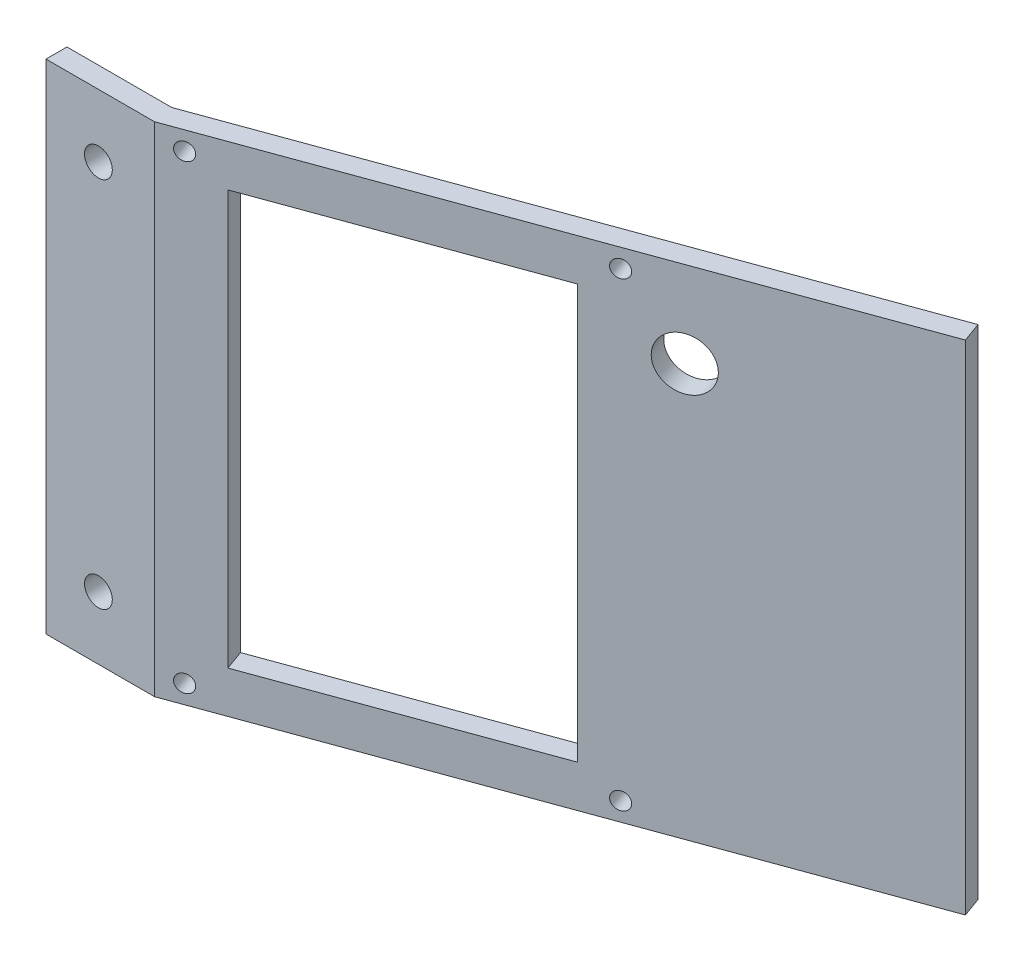
ISO-10303-21;
HEADER;
FILE_DESCRIPTION(('STEP AP214'),'2;1');
FILE_NAME('part.step','',(''),(''),'','','');
FILE_SCHEMA(('AUTOMOTIVE_DESIGN { 1 0 10303 214 1 1 1 1 }'));
ENDSEC;
DATA;
#1=APPLICATION_CONTEXT('core data for automotive mechanical design processes');
#2=APPLICATION_PROTOCOL_DEFINITION('international standard','automotive_design',2000,#1);
#3=PRODUCT_CONTEXT('',#1,'mechanical');
#4=PRODUCT('Part','Part','',(#3));
#5=PRODUCT_RELATED_PRODUCT_CATEGORY('part','',(#4));
#6=PRODUCT_DEFINITION_FORMATION('','',#4);
#7=PRODUCT_DEFINITION_CONTEXT('part definition',#1,'design');
#8=PRODUCT_DEFINITION('design','',#6,#7);
#9=PRODUCT_DEFINITION_SHAPE('','',#8);
#10=(LENGTH_UNIT() NAMED_UNIT(*) SI_UNIT(.MILLI.,.METRE.));
#11=(NAMED_UNIT(*) PLANE_ANGLE_UNIT() SI_UNIT($,.RADIAN.));
#12=(NAMED_UNIT(*) SI_UNIT($,.STERADIAN.) SOLID_ANGLE_UNIT());
#13=UNCERTAINTY_MEASURE_WITH_UNIT(LENGTH_MEASURE(1.E-05),#10,'distance_accuracy_value','');
#14=(GEOMETRIC_REPRESENTATION_CONTEXT(3) GLOBAL_UNCERTAINTY_ASSIGNED_CONTEXT((#13)) GLOBAL_UNIT_ASSIGNED_CONTEXT((#10,
#11,#12)) REPRESENTATION_CONTEXT('',''));
#15=CARTESIAN_POINT('',(0.,0.,0.));
#16=DIRECTION('',(0.,0.,1.));
#17=DIRECTION('',(1.,0.,0.));
#18=AXIS2_PLACEMENT_3D('',#15,#16,#17);
#19=CARTESIAN_POINT('',(0.,0.,4.));
#20=DIRECTION('',(0.,0.,1.));
#21=DIRECTION('',(1.,0.,0.));
#22=AXIS2_PLACEMENT_3D('',#19,#20,#21);
#23=PLANE('',#22);
#24=CARTESIAN_POINT('',(0.,35.5,4.));
#25=DIRECTION('',(0.,0.,1.));
#26=DIRECTION('',(1.,0.,0.));
#27=AXIS2_PLACEMENT_3D('',#24,#25,#26);
#28=CIRCLE('',#27,2.65);
#29=CARTESIAN_POINT('',(2.65000000000001,35.5,4.));
#30=VERTEX_POINT('',#29);
#31=EDGE_CURVE('E209',#30,#30,#28,.T.);
#32=ORIENTED_EDGE('',*,*,#31,.F.);
#33=EDGE_LOOP('',(#32));
#34=FACE_BOUND('',#33,.T.);
#35=DIRECTION('',(-1.,0.,0.));
#36=VECTOR('',#35,1.);
#37=CARTESIAN_POINT('',(-10.,47.5,4.));
#38=LINE('',#37,#36);
#39=CARTESIAN_POINT('',(10.7053079228338,47.5,4.));
#40=VERTEX_POINT('',#39);
#41=CARTESIAN_POINT('',(-10.,47.5,4.));
#42=VERTEX_POINT('',#41);
#43=EDGE_CURVE('E215',#40,#42,#38,.T.);
#44=ORIENTED_EDGE('',*,*,#43,.T.);
#45=DIRECTION('',(0.,-1.,0.));
#46=VECTOR('',#45,1.);
#47=CARTESIAN_POINT('',(-10.,-47.5,4.));
#48=LINE('',#47,#46);
#49=CARTESIAN_POINT('',(-10.,-47.5,4.));
#50=VERTEX_POINT('',#49);
#51=EDGE_CURVE('E218',#42,#50,#48,.T.);
#52=ORIENTED_EDGE('',*,*,#51,.T.);
#53=DIRECTION('',(1.,0.,0.));
#54=VECTOR('',#53,1.);
#55=CARTESIAN_POINT('',(-10.,-47.5,4.));
#56=LINE('',#55,#54);
#57=CARTESIAN_POINT('',(10.7053079228338,-47.5,4.));
#58=VERTEX_POINT('',#57);
#59=EDGE_CURVE('E221',#50,#58,#56,.T.);
#60=ORIENTED_EDGE('',*,*,#59,.T.);
#61=DIRECTION('',(0.,-1.,0.));
#62=VECTOR('',#61,1.);
#63=CARTESIAN_POINT('',(10.7053079228338,170.197795557611,4.));
#64=LINE('',#63,#62);
#65=EDGE_CURVE('E183',#40,#58,#64,.T.);
#66=ORIENTED_EDGE('',*,*,#65,.F.);
#67=EDGE_LOOP('',(#44,#52,#60,#66));
#68=FACE_BOUND('',#67,.T.);
#69=CARTESIAN_POINT('',(0.,-35.5,4.));
#70=DIRECTION('',(0.,0.,1.));
#71=DIRECTION('',(1.,0.,0.));
#72=AXIS2_PLACEMENT_3D('',#69,#70,#71);
#73=CIRCLE('',#72,2.65);
#74=CARTESIAN_POINT('',(2.65000000000002,-35.5,4.));
#75=VERTEX_POINT('',#74);
#76=EDGE_CURVE('E203',#75,#75,#73,.T.);
#77=ORIENTED_EDGE('',*,*,#76,.F.);
#78=EDGE_LOOP('',(#77));
#79=FACE_BOUND('',#78,.T.);
#80=ADVANCED_FACE('F39',(#34,#68,#79),#23,.T.);
#81=CARTESIAN_POINT('',(0.,0.,0.));
#82=DIRECTION('',(0.,0.,1.));
#83=DIRECTION('',(1.,0.,0.));
#84=AXIS2_PLACEMENT_3D('',#81,#82,#83);
#85=PLANE('',#84);
#86=DIRECTION('',(-1.,0.,0.));
#87=VECTOR('',#86,1.);
#88=CARTESIAN_POINT('',(-10.,47.5,0.));
#89=LINE('',#88,#87);
#90=CARTESIAN_POINT('',(10.,47.5,0.));
#91=VERTEX_POINT('',#90);
#92=CARTESIAN_POINT('',(-10.,47.5,0.));
#93=VERTEX_POINT('',#92);
#94=EDGE_CURVE('E212',#91,#93,#89,.T.);
#95=ORIENTED_EDGE('',*,*,#94,.F.);
#96=DIRECTION('',(0.,1.,0.));
#97=VECTOR('',#96,1.);
#98=CARTESIAN_POINT('',(9.99999999999999,-47.5,0.));
#99=LINE('',#98,#97);
#100=CARTESIAN_POINT('',(9.99999999999999,-47.5,0.));
#101=VERTEX_POINT('',#100);
#102=EDGE_CURVE('E219',#101,#91,#99,.T.);
#103=ORIENTED_EDGE('',*,*,#102,.F.);
#104=DIRECTION('',(1.,0.,0.));
#105=VECTOR('',#104,1.);
#106=CARTESIAN_POINT('',(-10.,-47.5,0.));
#107=LINE('',#106,#105);
#108=CARTESIAN_POINT('',(-10.,-47.5,0.));
#109=VERTEX_POINT('',#108);
#110=EDGE_CURVE('E227',#109,#101,#107,.T.);
#111=ORIENTED_EDGE('',*,*,#110,.F.);
#112=DIRECTION('',(0.,-1.,0.));
#113=VECTOR('',#112,1.);
#114=CARTESIAN_POINT('',(-10.,-47.5,0.));
#115=LINE('',#114,#113);
#116=EDGE_CURVE('E225',#93,#109,#115,.T.);
#117=ORIENTED_EDGE('',*,*,#116,.F.);
#118=EDGE_LOOP('',(#95,#103,#111,#117));
#119=FACE_BOUND('',#118,.T.);
#120=CARTESIAN_POINT('',(0.,35.5,0.));
#121=DIRECTION('',(0.,0.,1.));
#122=DIRECTION('',(1.,0.,0.));
#123=AXIS2_PLACEMENT_3D('',#120,#121,#122);
#124=CIRCLE('',#123,2.65);
#125=CARTESIAN_POINT('',(2.65000000000001,35.5,0.));
#126=VERTEX_POINT('',#125);
#127=EDGE_CURVE('E206',#126,#126,#124,.T.);
#128=ORIENTED_EDGE('',*,*,#127,.T.);
#129=EDGE_LOOP('',(#128));
#130=FACE_BOUND('',#129,.T.);
#131=CARTESIAN_POINT('',(0.,-35.5,0.));
#132=DIRECTION('',(0.,0.,1.));
#133=DIRECTION('',(1.,0.,0.));
#134=AXIS2_PLACEMENT_3D('',#131,#132,#133);
#135=CIRCLE('',#134,2.65);
#136=CARTESIAN_POINT('',(2.65000000000002,-35.5,0.));
#137=VERTEX_POINT('',#136);
#138=EDGE_CURVE('E202',#137,#137,#135,.T.);
#139=ORIENTED_EDGE('',*,*,#138,.T.);
#140=EDGE_LOOP('',(#139));
#141=FACE_BOUND('',#140,.T.);
#142=ADVANCED_FACE('F240',(#119,#130,#141),#85,.F.);
#143=CARTESIAN_POINT('',(-10.,47.5,4.));
#144=DIRECTION('',(0.,-1.,0.));
#145=DIRECTION('',(0.,0.,-1.));
#146=AXIS2_PLACEMENT_3D('',#143,#144,#145);
#147=PLANE('',#146);
#148=ORIENTED_EDGE('',*,*,#94,.T.);
#149=DIRECTION('',(0.,0.,-1.));
#150=VECTOR('',#149,1.);
#151=CARTESIAN_POINT('',(-10.,47.5,4.));
#152=LINE('',#151,#150);
#153=EDGE_CURVE('E11',#42,#93,#152,.T.);
#154=ORIENTED_EDGE('',*,*,#153,.F.);
#155=ORIENTED_EDGE('',*,*,#43,.F.);
#156=DIRECTION('',(0.939692620785908,0.,-0.342020143325669));
#157=VECTOR('',#156,1.);
#158=CARTESIAN_POINT('',(124.131195067612,47.5,-37.2836467159367));
#159=LINE('',#158,#157);
#160=CARTESIAN_POINT('',(124.131195067612,47.5,-37.2836467159367));
#161=VERTEX_POINT('',#160);
#162=EDGE_CURVE('E182',#40,#161,#159,.T.);
#163=ORIENTED_EDGE('',*,*,#162,.T.);
#164=DIRECTION('',(-0.342020143325669,0.,-0.939692620785908));
#165=VECTOR('',#164,1.);
#166=CARTESIAN_POINT('',(122.763114494309,47.5,-41.0424171990804));
#167=LINE('',#166,#165);
#168=CARTESIAN_POINT('',(122.763114494309,47.5,-41.0424171990804));
#169=VERTEX_POINT('',#168);
#170=EDGE_CURVE('E180',#161,#169,#167,.T.);
#171=ORIENTED_EDGE('',*,*,#170,.T.);
#172=DIRECTION('',(-0.939692620785908,0.,0.34202014332567));
#173=VECTOR('',#172,1.);
#174=CARTESIAN_POINT('',(9.99999999999999,47.5,0.));
#175=LINE('',#174,#173);
#176=EDGE_CURVE('E185',#169,#91,#175,.T.);
#177=ORIENTED_EDGE('',*,*,#176,.T.);
#178=EDGE_LOOP('',(#148,#154,#155,#163,#171,#177));
#179=FACE_BOUND('',#178,.T.);
#180=ADVANCED_FACE('F41',(#179),#147,.F.);
#181=CARTESIAN_POINT('',(-10.,-47.5,4.));
#182=DIRECTION('',(1.,0.,0.));
#183=DIRECTION('',(0.,0.,-1.));
#184=AXIS2_PLACEMENT_3D('',#181,#182,#183);
#185=PLANE('',#184);
#186=ORIENTED_EDGE('',*,*,#116,.T.);
#187=DIRECTION('',(0.,0.,-1.));
#188=VECTOR('',#187,1.);
#189=CARTESIAN_POINT('',(-10.,-47.5,4.));
#190=LINE('',#189,#188);
#191=EDGE_CURVE('E47',#50,#109,#190,.T.);
#192=ORIENTED_EDGE('',*,*,#191,.F.);
#193=ORIENTED_EDGE('',*,*,#51,.F.);
#194=ORIENTED_EDGE('',*,*,#153,.T.);
#195=EDGE_LOOP('',(#186,#192,#193,#194));
#196=FACE_BOUND('',#195,.T.);
#197=ADVANCED_FACE('F258',(#196),#185,.F.);
#198=CARTESIAN_POINT('',(-10.,-47.5,4.));
#199=DIRECTION('',(0.,1.,0.));
#200=DIRECTION('',(0.,0.,1.));
#201=AXIS2_PLACEMENT_3D('',#198,#199,#200);
#202=PLANE('',#201);
#203=ORIENTED_EDGE('',*,*,#110,.T.);
#204=DIRECTION('',(0.939692620785908,0.,-0.34202014332567));
#205=VECTOR('',#204,1.);
#206=CARTESIAN_POINT('',(9.99999999999999,-47.5,0.));
#207=LINE('',#206,#205);
#208=CARTESIAN_POINT('',(122.763114494309,-47.5,-41.0424171990804));
#209=VERTEX_POINT('',#208);
#210=EDGE_CURVE('E179',#101,#209,#207,.T.);
#211=ORIENTED_EDGE('',*,*,#210,.T.);
#212=DIRECTION('',(0.342020143325669,0.,0.939692620785908));
#213=VECTOR('',#212,1.);
#214=CARTESIAN_POINT('',(122.763114494309,-47.5,-41.0424171990804));
#215=LINE('',#214,#213);
#216=CARTESIAN_POINT('',(124.131195067612,-47.5,-37.2836467159367));
#217=VERTEX_POINT('',#216);
#218=EDGE_CURVE('E188',#209,#217,#215,.T.);
#219=ORIENTED_EDGE('',*,*,#218,.T.);
#220=DIRECTION('',(-0.939692620785908,0.,0.342020143325669));
#221=VECTOR('',#220,1.);
#222=CARTESIAN_POINT('',(124.131195067612,-47.5,-37.2836467159367));
#223=LINE('',#222,#221);
#224=EDGE_CURVE('E191',#217,#58,#223,.T.);
#225=ORIENTED_EDGE('',*,*,#224,.T.);
#226=ORIENTED_EDGE('',*,*,#59,.F.);
#227=ORIENTED_EDGE('',*,*,#191,.T.);
#228=EDGE_LOOP('',(#203,#211,#219,#225,#226,#227));
#229=FACE_BOUND('',#228,.T.);
#230=ADVANCED_FACE('F236',(#229),#202,.F.);
#231=CARTESIAN_POINT('',(0.,35.5,4.));
#232=DIRECTION('',(0.,0.,-1.));
#233=DIRECTION('',(-1.,0.,0.));
#234=AXIS2_PLACEMENT_3D('',#231,#232,#233);
#235=CYLINDRICAL_SURFACE('',#234,2.65);
#236=ORIENTED_EDGE('',*,*,#31,.T.);
#237=EDGE_LOOP('',(#236));
#238=FACE_BOUND('',#237,.T.);
#239=ORIENTED_EDGE('',*,*,#127,.F.);
#240=EDGE_LOOP('',(#239));
#241=FACE_BOUND('',#240,.T.);
#242=ADVANCED_FACE('F275',(#238,#241),#235,.F.);
#243=CARTESIAN_POINT('',(0.,-35.5,4.));
#244=DIRECTION('',(0.,0.,-1.));
#245=DIRECTION('',(-1.,0.,0.));
#246=AXIS2_PLACEMENT_3D('',#243,#244,#245);
#247=CYLINDRICAL_SURFACE('',#246,2.65);
#248=ORIENTED_EDGE('',*,*,#76,.T.);
#249=EDGE_LOOP('',(#248));
#250=FACE_BOUND('',#249,.T.);
#251=ORIENTED_EDGE('',*,*,#138,.F.);
#252=EDGE_LOOP('',(#251));
#253=FACE_BOUND('',#252,.T.);
#254=ADVANCED_FACE('F282',(#250,#253),#247,.F.);
#255=CARTESIAN_POINT('',(124.131195067612,170.197795557611,-37.2836467159367));
#256=DIRECTION('',(0.342020143325669,0.,0.939692620785908));
#257=DIRECTION('',(0.939692620785908,0.,-0.342020143325669));
#258=AXIS2_PLACEMENT_3D('',#255,#256,#257);
#259=PLANE('',#258);
#260=CARTESIAN_POINT('',(84.8725896885823,31.0999999999998,-22.994682919167));
#261=DIRECTION('',(0.342020143325669,0.,0.939692620785908));
#262=DIRECTION('',(0.939692620785908,0.,-0.342020143325669));
#263=AXIS2_PLACEMENT_3D('',#260,#261,#262);
#264=CIRCLE('',#263,5.);
#265=CARTESIAN_POINT('',(89.5710527925119,31.0999999999998,-24.7047836357954));
#266=VERTEX_POINT('',#265);
#267=EDGE_CURVE('E176',#266,#266,#264,.T.);
#268=ORIENTED_EDGE('',*,*,#267,.F.);
#269=EDGE_LOOP('',(#268));
#270=FACE_BOUND('',#269,.T.);
#271=CARTESIAN_POINT('',(14.9124740710716,43.95,2.46871675142905));
#272=DIRECTION('',(0.342020143325669,0.,0.939692620785908));
#273=DIRECTION('',(0.939692620785908,0.,-0.342020143325669));
#274=AXIS2_PLACEMENT_3D('',#271,#272,#273);
#275=CIRCLE('',#274,1.65);
#276=CARTESIAN_POINT('',(16.4629668953683,43.95,1.90438351494169));
#277=VERTEX_POINT('',#276);
#278=EDGE_CURVE('E173',#277,#277,#275,.T.);
#279=ORIENTED_EDGE('',*,*,#278,.F.);
#280=EDGE_LOOP('',(#279));
#281=FACE_BOUND('',#280,.T.);
#282=CARTESIAN_POINT('',(75.898525160077,43.95,-19.7283905504069));
#283=DIRECTION('',(0.342020143325669,0.,0.939692620785908));
#284=DIRECTION('',(0.939692620785908,0.,-0.342020143325669));
#285=AXIS2_PLACEMENT_3D('',#282,#283,#284);
#286=CIRCLE('',#285,1.65);
#287=CARTESIAN_POINT('',(77.4490179843738,43.95,-20.2927237868942));
#288=VERTEX_POINT('',#287);
#289=EDGE_CURVE('E170',#288,#288,#286,.T.);
#290=ORIENTED_EDGE('',*,*,#289,.F.);
#291=EDGE_LOOP('',(#290));
#292=FACE_BOUND('',#291,.T.);
#293=CARTESIAN_POINT('',(75.898525160077,-43.95,-19.7283905504069));
#294=DIRECTION('',(0.342020143325669,0.,0.939692620785908));
#295=DIRECTION('',(0.939692620785908,0.,-0.342020143325669));
#296=AXIS2_PLACEMENT_3D('',#293,#294,#295);
#297=CIRCLE('',#296,1.65);
#298=CARTESIAN_POINT('',(77.4490179843737,-43.95,-20.2927237868942));
#299=VERTEX_POINT('',#298);
#300=EDGE_CURVE('E167',#299,#299,#297,.T.);
#301=ORIENTED_EDGE('',*,*,#300,.F.);
#302=EDGE_LOOP('',(#301));
#303=FACE_BOUND('',#302,.T.);
#304=DIRECTION('',(0.939692620785908,0.,-0.342020143325669));
#305=VECTOR('',#304,1.);
#306=CARTESIAN_POINT('',(124.131195067612,-39.5,-37.2836467159367));
#307=LINE('',#306,#305);
#308=CARTESIAN_POINT('',(20.9734914751407,-39.5,0.262686826978484));
#309=VERTEX_POINT('',#308);
#310=CARTESIAN_POINT('',(69.8375077560079,-39.5,-17.5223606259563));
#311=VERTEX_POINT('',#310);
#312=EDGE_CURVE('E119',#309,#311,#307,.T.);
#313=ORIENTED_EDGE('',*,*,#312,.F.);
#314=DIRECTION('',(0.,-1.,0.));
#315=VECTOR('',#314,1.);
#316=CARTESIAN_POINT('',(20.9734914751407,170.197795557611,0.26268682697847));
#317=LINE('',#316,#315);
#318=CARTESIAN_POINT('',(20.9734914751407,39.5,0.262686826978476));
#319=VERTEX_POINT('',#318);
#320=EDGE_CURVE('E160',#319,#309,#317,.T.);
#321=ORIENTED_EDGE('',*,*,#320,.F.);
#322=DIRECTION('',(-0.939692620785908,0.,0.342020143325669));
#323=VECTOR('',#322,1.);
#324=CARTESIAN_POINT('',(124.131195067612,39.5,-37.2836467159367));
#325=LINE('',#324,#323);
#326=CARTESIAN_POINT('',(69.8375077560079,39.5,-17.5223606259563));
#327=VERTEX_POINT('',#326);
#328=EDGE_CURVE('E162',#327,#319,#325,.T.);
#329=ORIENTED_EDGE('',*,*,#328,.F.);
#330=DIRECTION('',(0.,1.,0.));
#331=VECTOR('',#330,1.);
#332=CARTESIAN_POINT('',(69.8375077560079,170.197795557611,-17.5223606259563));
#333=LINE('',#332,#331);
#334=EDGE_CURVE('E164',#311,#327,#333,.T.);
#335=ORIENTED_EDGE('',*,*,#334,.F.);
#336=EDGE_LOOP('',(#313,#321,#329,#335));
#337=FACE_BOUND('',#336,.T.);
#338=CARTESIAN_POINT('',(14.9124740710715,-43.95,2.46871675142906));
#339=DIRECTION('',(0.342020143325669,0.,0.939692620785908));
#340=DIRECTION('',(0.939692620785908,0.,-0.342020143325669));
#341=AXIS2_PLACEMENT_3D('',#338,#339,#340);
#342=CIRCLE('',#341,1.65);
#343=CARTESIAN_POINT('',(16.4629668953683,-43.95,1.90438351494171));
#344=VERTEX_POINT('',#343);
#345=EDGE_CURVE('E157',#344,#344,#342,.T.);
#346=ORIENTED_EDGE('',*,*,#345,.F.);
#347=EDGE_LOOP('',(#346));
#348=FACE_BOUND('',#347,.T.);
#349=ORIENTED_EDGE('',*,*,#162,.F.);
#350=ORIENTED_EDGE('',*,*,#65,.T.);
#351=ORIENTED_EDGE('',*,*,#224,.F.);
#352=DIRECTION('',(0.,-1.,0.));
#353=VECTOR('',#352,1.);
#354=CARTESIAN_POINT('',(124.131195067612,170.197795557611,-37.2836467159367));
#355=LINE('',#354,#353);
#356=EDGE_CURVE('E197',#161,#217,#355,.T.);
#357=ORIENTED_EDGE('',*,*,#356,.F.);
#358=EDGE_LOOP('',(#349,#350,#351,#357));
#359=FACE_BOUND('',#358,.T.);
#360=ADVANCED_FACE('F253',(#270,#281,#292,#303,#337,#348,#359),#259,.T.);
#361=CARTESIAN_POINT('',(122.763114494309,170.197795557611,-41.0424171990804));
#362=DIRECTION('',(0.939692620785908,0.,-0.342020143325669));
#363=DIRECTION('',(-0.342020143325669,0.,-0.939692620785908));
#364=AXIS2_PLACEMENT_3D('',#361,#362,#363);
#365=PLANE('',#364);
#366=ORIENTED_EDGE('',*,*,#170,.F.);
#367=ORIENTED_EDGE('',*,*,#356,.T.);
#368=ORIENTED_EDGE('',*,*,#218,.F.);
#369=DIRECTION('',(0.,-1.,0.));
#370=VECTOR('',#369,1.);
#371=CARTESIAN_POINT('',(122.763114494309,170.197795557611,-41.0424171990804));
#372=LINE('',#371,#370);
#373=EDGE_CURVE('E194',#169,#209,#372,.T.);
#374=ORIENTED_EDGE('',*,*,#373,.F.);
#375=EDGE_LOOP('',(#366,#367,#368,#374));
#376=FACE_BOUND('',#375,.T.);
#377=ADVANCED_FACE('F249',(#376),#365,.T.);
#378=CARTESIAN_POINT('',(9.99999999999999,170.197795557611,0.));
#379=DIRECTION('',(-0.34202014332567,0.,-0.939692620785908));
#380=DIRECTION('',(-0.939692620785908,0.,0.34202014332567));
#381=AXIS2_PLACEMENT_3D('',#378,#379,#380);
#382=PLANE('',#381);
#383=CARTESIAN_POINT('',(83.5045091152797,31.0999999999998,-26.7534534023106));
#384=DIRECTION('',(-0.34202014332567,0.,-0.939692620785908));
#385=DIRECTION('',(-0.939692620785908,0.,0.34202014332567));
#386=AXIS2_PLACEMENT_3D('',#383,#384,#385);
#387=CIRCLE('',#386,5.);
#388=CARTESIAN_POINT('',(78.8060460113501,31.0999999999998,-25.0433526856823));
#389=VERTEX_POINT('',#388);
#390=EDGE_CURVE('E138',#389,#389,#387,.T.);
#391=ORIENTED_EDGE('',*,*,#390,.F.);
#392=EDGE_LOOP('',(#391));
#393=FACE_BOUND('',#392,.T.);
#394=CARTESIAN_POINT('',(13.5443934977689,43.95,-1.29005373171456));
#395=DIRECTION('',(-0.34202014332567,0.,-0.939692620785908));
#396=DIRECTION('',(-0.939692620785908,0.,0.34202014332567));
#397=AXIS2_PLACEMENT_3D('',#394,#395,#396);
#398=CIRCLE('',#397,1.65);
#399=CARTESIAN_POINT('',(11.9939006734722,43.95,-0.725720495227205));
#400=VERTEX_POINT('',#399);
#401=EDGE_CURVE('E141',#400,#400,#398,.T.);
#402=ORIENTED_EDGE('',*,*,#401,.F.);
#403=EDGE_LOOP('',(#402));
#404=FACE_BOUND('',#403,.T.);
#405=CARTESIAN_POINT('',(74.5304445867743,43.95,-23.4871610335505));
#406=DIRECTION('',(-0.34202014332567,0.,-0.939692620785908));
#407=DIRECTION('',(-0.939692620785908,0.,0.34202014332567));
#408=AXIS2_PLACEMENT_3D('',#405,#406,#407);
#409=CIRCLE('',#408,1.65);
#410=CARTESIAN_POINT('',(72.9799517624776,43.95,-22.9228277970632));
#411=VERTEX_POINT('',#410);
#412=EDGE_CURVE('E147',#411,#411,#409,.T.);
#413=ORIENTED_EDGE('',*,*,#412,.F.);
#414=EDGE_LOOP('',(#413));
#415=FACE_BOUND('',#414,.T.);
#416=CARTESIAN_POINT('',(74.5304445867743,-43.95,-23.4871610335505));
#417=DIRECTION('',(-0.34202014332567,0.,-0.939692620785908));
#418=DIRECTION('',(-0.939692620785908,0.,0.34202014332567));
#419=AXIS2_PLACEMENT_3D('',#416,#417,#418);
#420=CIRCLE('',#419,1.65);
#421=CARTESIAN_POINT('',(72.9799517624776,-43.95,-22.9228277970632));
#422=VERTEX_POINT('',#421);
#423=EDGE_CURVE('E149',#422,#422,#420,.T.);
#424=ORIENTED_EDGE('',*,*,#423,.F.);
#425=EDGE_LOOP('',(#424));
#426=FACE_BOUND('',#425,.T.);
#427=DIRECTION('',(-0.939692620785908,0.,0.34202014332567));
#428=VECTOR('',#427,1.);
#429=CARTESIAN_POINT('',(19.605410901838,-39.5,-3.49608365616513));
#430=LINE('',#429,#428);
#431=CARTESIAN_POINT('',(68.4694271827052,-39.5,-21.2811311091));
#432=VERTEX_POINT('',#431);
#433=CARTESIAN_POINT('',(19.605410901838,-39.5,-3.49608365616513));
#434=VERTEX_POINT('',#433);
#435=EDGE_CURVE('E62',#432,#434,#430,.T.);
#436=ORIENTED_EDGE('',*,*,#435,.F.);
#437=DIRECTION('',(0.,-1.,0.));
#438=VECTOR('',#437,1.);
#439=CARTESIAN_POINT('',(68.4694271827052,-39.5,-21.2811311091));
#440=LINE('',#439,#438);
#441=CARTESIAN_POINT('',(68.4694271827052,39.5,-21.2811311091));
#442=VERTEX_POINT('',#441);
#443=EDGE_CURVE('E125',#442,#432,#440,.T.);
#444=ORIENTED_EDGE('',*,*,#443,.F.);
#445=DIRECTION('',(0.939692620785908,0.,-0.34202014332567));
#446=VECTOR('',#445,1.);
#447=CARTESIAN_POINT('',(19.605410901838,39.5,-3.49608365616513));
#448=LINE('',#447,#446);
#449=CARTESIAN_POINT('',(19.605410901838,39.5,-3.49608365616513));
#450=VERTEX_POINT('',#449);
#451=EDGE_CURVE('E131',#450,#442,#448,.T.);
#452=ORIENTED_EDGE('',*,*,#451,.F.);
#453=DIRECTION('',(0.,1.,0.));
#454=VECTOR('',#453,1.);
#455=CARTESIAN_POINT('',(19.605410901838,-39.5,-3.49608365616513));
#456=LINE('',#455,#454);
#457=EDGE_CURVE('E137',#434,#450,#456,.T.);
#458=ORIENTED_EDGE('',*,*,#457,.F.);
#459=EDGE_LOOP('',(#436,#444,#452,#458));
#460=FACE_BOUND('',#459,.T.);
#461=CARTESIAN_POINT('',(13.5443934977689,-43.95,-1.29005373171455));
#462=DIRECTION('',(-0.34202014332567,0.,-0.939692620785908));
#463=DIRECTION('',(-0.939692620785908,0.,0.34202014332567));
#464=AXIS2_PLACEMENT_3D('',#461,#462,#463);
#465=CIRCLE('',#464,1.65);
#466=CARTESIAN_POINT('',(11.9939006734721,-43.95,-0.725720495227194));
#467=VERTEX_POINT('',#466);
#468=EDGE_CURVE('E152',#467,#467,#465,.T.);
#469=ORIENTED_EDGE('',*,*,#468,.F.);
#470=EDGE_LOOP('',(#469));
#471=FACE_BOUND('',#470,.T.);
#472=ORIENTED_EDGE('',*,*,#176,.F.);
#473=ORIENTED_EDGE('',*,*,#373,.T.);
#474=ORIENTED_EDGE('',*,*,#210,.F.);
#475=ORIENTED_EDGE('',*,*,#102,.T.);
#476=EDGE_LOOP('',(#472,#473,#474,#475));
#477=FACE_BOUND('',#476,.T.);
#478=ADVANCED_FACE('F135',(#393,#404,#415,#426,#460,#471,#477),#382,.T.);
#479=CARTESIAN_POINT('',(28.1807823669119,-43.95,38.9230941886126));
#480=DIRECTION('',(-0.34202014332567,0.,-0.939692620785908));
#481=DIRECTION('',(-0.939692620785908,0.,0.34202014332567));
#482=AXIS2_PLACEMENT_3D('',#479,#480,#481);
#483=CYLINDRICAL_SURFACE('',#482,1.65);
#484=ORIENTED_EDGE('',*,*,#345,.T.);
#485=EDGE_LOOP('',(#484));
#486=FACE_BOUND('',#485,.T.);
#487=ORIENTED_EDGE('',*,*,#468,.T.);
#488=EDGE_LOOP('',(#487));
#489=FACE_BOUND('',#488,.T.);
#490=ADVANCED_FACE('F300',(#486,#489),#483,.F.);
#491=CARTESIAN_POINT('',(34.241799770981,-39.5,36.717064264162));
#492=DIRECTION('',(0.,-1.,0.));
#493=DIRECTION('',(0.,0.,-1.));
#494=AXIS2_PLACEMENT_3D('',#491,#492,#493);
#495=PLANE('',#494);
#496=ORIENTED_EDGE('',*,*,#312,.T.);
#497=DIRECTION('',(-0.34202014332567,0.,-0.939692620785908));
#498=VECTOR('',#497,1.);
#499=CARTESIAN_POINT('',(83.1058160518482,-39.5,18.9320168112272));
#500=LINE('',#499,#498);
#501=EDGE_CURVE('E115',#311,#432,#500,.T.);
#502=ORIENTED_EDGE('',*,*,#501,.T.);
#503=ORIENTED_EDGE('',*,*,#435,.T.);
#504=DIRECTION('',(-0.34202014332567,0.,-0.939692620785908));
#505=VECTOR('',#504,1.);
#506=CARTESIAN_POINT('',(34.241799770981,-39.5,36.717064264162));
#507=LINE('',#506,#505);
#508=EDGE_CURVE('E132',#309,#434,#507,.T.);
#509=ORIENTED_EDGE('',*,*,#508,.F.);
#510=EDGE_LOOP('',(#496,#502,#503,#509));
#511=FACE_BOUND('',#510,.T.);
#512=ADVANCED_FACE('F117',(#511),#495,.F.);
#513=CARTESIAN_POINT('',(83.1058160518482,-39.5,18.9320168112272));
#514=DIRECTION('',(0.939692620785908,0.,-0.34202014332567));
#515=DIRECTION('',(-0.34202014332567,0.,-0.939692620785908));
#516=AXIS2_PLACEMENT_3D('',#513,#514,#515);
#517=PLANE('',#516);
#518=ORIENTED_EDGE('',*,*,#334,.T.);
#519=DIRECTION('',(-0.34202014332567,0.,-0.939692620785908));
#520=VECTOR('',#519,1.);
#521=CARTESIAN_POINT('',(83.1058160518482,39.5,18.9320168112272));
#522=LINE('',#521,#520);
#523=EDGE_CURVE('E122',#327,#442,#522,.T.);
#524=ORIENTED_EDGE('',*,*,#523,.T.);
#525=ORIENTED_EDGE('',*,*,#443,.T.);
#526=ORIENTED_EDGE('',*,*,#501,.F.);
#527=EDGE_LOOP('',(#518,#524,#525,#526));
#528=FACE_BOUND('',#527,.T.);
#529=ADVANCED_FACE('F126',(#528),#517,.F.);
#530=CARTESIAN_POINT('',(34.241799770981,39.5,36.717064264162));
#531=DIRECTION('',(0.,1.,0.));
#532=DIRECTION('',(0.,0.,1.));
#533=AXIS2_PLACEMENT_3D('',#530,#531,#532);
#534=PLANE('',#533);
#535=ORIENTED_EDGE('',*,*,#328,.T.);
#536=DIRECTION('',(-0.34202014332567,0.,-0.939692620785908));
#537=VECTOR('',#536,1.);
#538=CARTESIAN_POINT('',(34.241799770981,39.5,36.717064264162));
#539=LINE('',#538,#537);
#540=EDGE_CURVE('E54',#319,#450,#539,.T.);
#541=ORIENTED_EDGE('',*,*,#540,.T.);
#542=ORIENTED_EDGE('',*,*,#451,.T.);
#543=ORIENTED_EDGE('',*,*,#523,.F.);
#544=EDGE_LOOP('',(#535,#541,#542,#543));
#545=FACE_BOUND('',#544,.T.);
#546=ADVANCED_FACE('F325',(#545),#534,.F.);
#547=CARTESIAN_POINT('',(34.241799770981,-39.5,36.717064264162));
#548=DIRECTION('',(-0.939692620785908,0.,0.34202014332567));
#549=DIRECTION('',(0.34202014332567,0.,0.939692620785908));
#550=AXIS2_PLACEMENT_3D('',#547,#548,#549);
#551=PLANE('',#550);
#552=ORIENTED_EDGE('',*,*,#320,.T.);
#553=ORIENTED_EDGE('',*,*,#508,.T.);
#554=ORIENTED_EDGE('',*,*,#457,.T.);
#555=ORIENTED_EDGE('',*,*,#540,.F.);
#556=EDGE_LOOP('',(#552,#553,#554,#555));
#557=FACE_BOUND('',#556,.T.);
#558=ADVANCED_FACE('F314',(#557),#551,.F.);
#559=CARTESIAN_POINT('',(89.1668334559173,-43.95,16.7259868867767));
#560=DIRECTION('',(-0.34202014332567,0.,-0.939692620785908));
#561=DIRECTION('',(-0.939692620785908,0.,0.34202014332567));
#562=AXIS2_PLACEMENT_3D('',#559,#560,#561);
#563=CYLINDRICAL_SURFACE('',#562,1.65);
#564=ORIENTED_EDGE('',*,*,#300,.T.);
#565=EDGE_LOOP('',(#564));
#566=FACE_BOUND('',#565,.T.);
#567=ORIENTED_EDGE('',*,*,#423,.T.);
#568=EDGE_LOOP('',(#567));
#569=FACE_BOUND('',#568,.T.);
#570=ADVANCED_FACE('F310',(#566,#569),#563,.F.);
#571=CARTESIAN_POINT('',(89.1668334559173,43.95,16.7259868867766));
#572=DIRECTION('',(-0.34202014332567,0.,-0.939692620785908));
#573=DIRECTION('',(-0.939692620785908,0.,0.34202014332567));
#574=AXIS2_PLACEMENT_3D('',#571,#572,#573);
#575=CYLINDRICAL_SURFACE('',#574,1.65);
#576=ORIENTED_EDGE('',*,*,#289,.T.);
#577=EDGE_LOOP('',(#576));
#578=FACE_BOUND('',#577,.T.);
#579=ORIENTED_EDGE('',*,*,#412,.T.);
#580=EDGE_LOOP('',(#579));
#581=FACE_BOUND('',#580,.T.);
#582=ADVANCED_FACE('F306',(#578,#581),#575,.F.);
#583=CARTESIAN_POINT('',(28.1807823669119,43.95,38.9230941886126));
#584=DIRECTION('',(-0.34202014332567,0.,-0.939692620785908));
#585=DIRECTION('',(-0.939692620785908,0.,0.34202014332567));
#586=AXIS2_PLACEMENT_3D('',#583,#584,#585);
#587=CYLINDRICAL_SURFACE('',#586,1.65);
#588=ORIENTED_EDGE('',*,*,#278,.T.);
#589=EDGE_LOOP('',(#588));
#590=FACE_BOUND('',#589,.T.);
#591=ORIENTED_EDGE('',*,*,#401,.T.);
#592=EDGE_LOOP('',(#591));
#593=FACE_BOUND('',#592,.T.);
#594=ADVANCED_FACE('F309',(#590,#593),#587,.F.);
#595=CARTESIAN_POINT('',(98.1408979844227,31.0999999999998,13.4596945180165));
#596=DIRECTION('',(-0.34202014332567,0.,-0.939692620785908));
#597=DIRECTION('',(-0.939692620785908,0.,0.34202014332567));
#598=AXIS2_PLACEMENT_3D('',#595,#596,#597);
#599=CYLINDRICAL_SURFACE('',#598,5.);
#600=ORIENTED_EDGE('',*,*,#267,.T.);
#601=EDGE_LOOP('',(#600));
#602=FACE_BOUND('',#601,.T.);
#603=ORIENTED_EDGE('',*,*,#390,.T.);
#604=EDGE_LOOP('',(#603));
#605=FACE_BOUND('',#604,.T.);
#606=ADVANCED_FACE('F316',(#602,#605),#599,.F.);
#607=CLOSED_SHELL('',(#80,#142,#180,#197,#230,#242,#254,#360,#377,#478,#490,#512,#529,#546,#558,
#570,#582,#594,#606));
#608=MANIFOLD_SOLID_BREP('B2',#607);
#609=ADVANCED_BREP_SHAPE_REPRESENTATION('',(#18,#608),#14);
#610=SHAPE_DEFINITION_REPRESENTATION(#9,#609);
ENDSEC;
END-ISO-10303-21;
